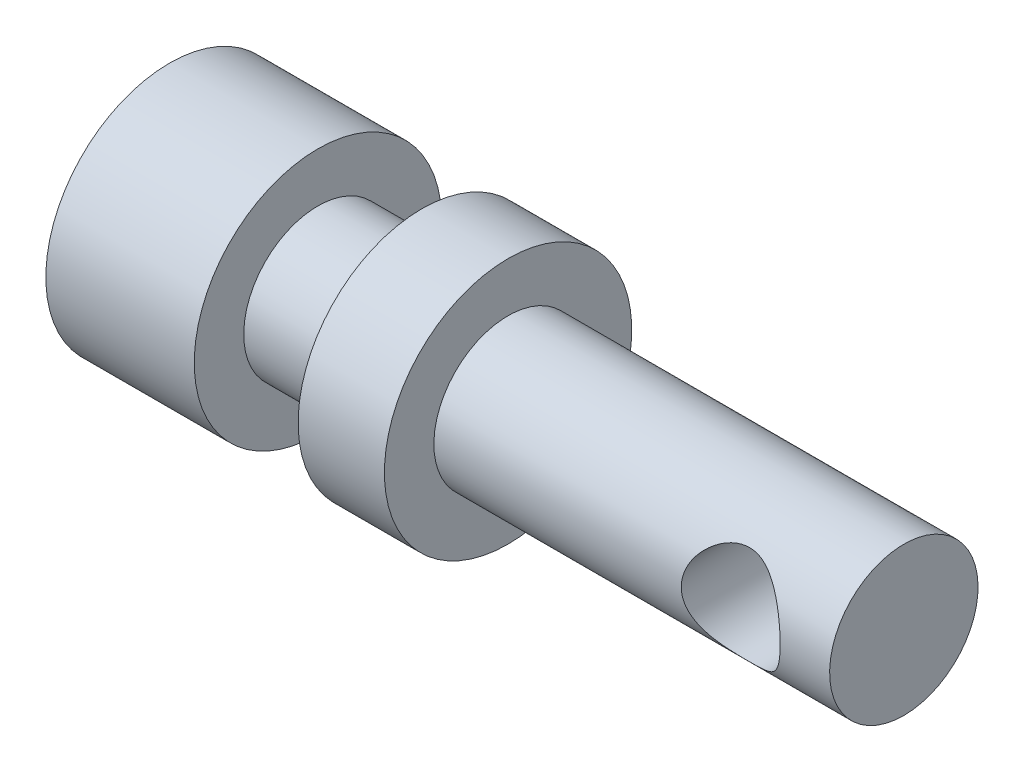
ISO-10303-21;
HEADER;
FILE_DESCRIPTION(('STEP AP214'),'2;1');
FILE_NAME('part.step','',(''),(''),'','','');
FILE_SCHEMA(('AUTOMOTIVE_DESIGN { 1 0 10303 214 1 1 1 1 }'));
ENDSEC;
DATA;
#1=APPLICATION_CONTEXT('core data for automotive mechanical design processes');
#2=APPLICATION_PROTOCOL_DEFINITION('international standard','automotive_design',2000,#1);
#3=PRODUCT_CONTEXT('',#1,'mechanical');
#4=PRODUCT('Part','Part','',(#3));
#5=PRODUCT_RELATED_PRODUCT_CATEGORY('part','',(#4));
#6=PRODUCT_DEFINITION_FORMATION('','',#4);
#7=PRODUCT_DEFINITION_CONTEXT('part definition',#1,'design');
#8=PRODUCT_DEFINITION('design','',#6,#7);
#9=PRODUCT_DEFINITION_SHAPE('','',#8);
#10=(LENGTH_UNIT() NAMED_UNIT(*) SI_UNIT(.MILLI.,.METRE.));
#11=(NAMED_UNIT(*) PLANE_ANGLE_UNIT() SI_UNIT($,.RADIAN.));
#12=(NAMED_UNIT(*) SI_UNIT($,.STERADIAN.) SOLID_ANGLE_UNIT());
#13=UNCERTAINTY_MEASURE_WITH_UNIT(LENGTH_MEASURE(1.E-05),#10,'distance_accuracy_value','');
#14=(GEOMETRIC_REPRESENTATION_CONTEXT(3) GLOBAL_UNCERTAINTY_ASSIGNED_CONTEXT((#13)) GLOBAL_UNIT_ASSIGNED_CONTEXT((#10,
#11,#12)) REPRESENTATION_CONTEXT('',''));
#15=CARTESIAN_POINT('',(0.,0.,0.));
#16=DIRECTION('',(0.,0.,1.));
#17=DIRECTION('',(1.,0.,0.));
#18=AXIS2_PLACEMENT_3D('',#15,#16,#17);
#19=CARTESIAN_POINT('',(0.,0.,0.));
#20=DIRECTION('',(-1.,0.,0.));
#21=DIRECTION('',(0.,-1.,0.));
#22=AXIS2_PLACEMENT_3D('',#19,#20,#21);
#23=CYLINDRICAL_SURFACE('',#22,2.5);
#24=CARTESIAN_POINT('',(0.,0.,0.));
#25=DIRECTION('',(-1.,0.,0.));
#26=DIRECTION('',(0.,-1.,0.));
#27=AXIS2_PLACEMENT_3D('',#24,#25,#26);
#28=CIRCLE('',#27,2.5);
#29=CARTESIAN_POINT('',(0.,-2.5,0.));
#30=VERTEX_POINT('',#29);
#31=EDGE_CURVE('E10',#30,#30,#28,.T.);
#32=ORIENTED_EDGE('',*,*,#31,.F.);
#33=EDGE_LOOP('',(#32));
#34=FACE_BOUND('',#33,.T.);
#35=CARTESIAN_POINT('',(3.,0.,0.));
#36=DIRECTION('',(-1.,0.,0.));
#37=DIRECTION('',(0.,-1.,0.));
#38=AXIS2_PLACEMENT_3D('',#35,#36,#37);
#39=CIRCLE('',#38,2.5);
#40=CARTESIAN_POINT('',(3.,-2.5,0.));
#41=VERTEX_POINT('',#40);
#42=EDGE_CURVE('E116',#41,#41,#39,.T.);
#43=ORIENTED_EDGE('',*,*,#42,.T.);
#44=EDGE_LOOP('',(#43));
#45=FACE_BOUND('',#44,.T.);
#46=ADVANCED_FACE('F43',(#34,#45),#23,.T.);
#47=CARTESIAN_POINT('',(0.,2.5,0.));
#48=DIRECTION('',(1.,0.,0.));
#49=DIRECTION('',(0.,1.,0.));
#50=AXIS2_PLACEMENT_3D('',#47,#48,#49);
#51=PLANE('',#50);
#52=ORIENTED_EDGE('',*,*,#31,.T.);
#53=EDGE_LOOP('',(#52));
#54=FACE_BOUND('',#53,.T.);
#55=ADVANCED_FACE('F108',(#54),#51,.F.);
#56=CARTESIAN_POINT('',(14.8439127302251,1.5,0.));
#57=DIRECTION('',(-1.,0.,0.));
#58=DIRECTION('',(0.,-1.,0.));
#59=AXIS2_PLACEMENT_3D('',#56,#57,#58);
#60=PLANE('',#59);
#61=CARTESIAN_POINT('',(14.8439127302251,0.,0.));
#62=DIRECTION('',(-1.,0.,0.));
#63=DIRECTION('',(0.,-1.,0.));
#64=AXIS2_PLACEMENT_3D('',#61,#62,#63);
#65=CIRCLE('',#64,1.5);
#66=CARTESIAN_POINT('',(14.8439127302251,-1.5,0.));
#67=VERTEX_POINT('',#66);
#68=EDGE_CURVE('E56',#67,#67,#65,.T.);
#69=ORIENTED_EDGE('',*,*,#68,.F.);
#70=EDGE_LOOP('',(#69));
#71=FACE_BOUND('',#70,.T.);
#72=ADVANCED_FACE('F103',(#71),#60,.F.);
#73=CARTESIAN_POINT('',(0.,0.,0.));
#74=DIRECTION('',(-1.,0.,0.));
#75=DIRECTION('',(0.,-1.,0.));
#76=AXIS2_PLACEMENT_3D('',#73,#74,#75);
#77=CYLINDRICAL_SURFACE('',#76,1.5);
#78=CARTESIAN_POINT('',(13.8439127302251,0.,-1.5));
#79=CARTESIAN_POINT('',(13.8439130050413,0.050242358334064,-1.50000020822414));
#80=CARTESIAN_POINT('',(13.8401057452474,0.100484543566457,-1.49745401376693));
#81=CARTESIAN_POINT('',(13.8251142981723,0.199366529015833,-1.48752326211906));
#82=CARTESIAN_POINT('',(13.8139266086635,0.248005556977501,-1.48013640790618));
#83=CARTESIAN_POINT('',(13.7848588715627,0.342106153927126,-1.46125241202354));
#84=CARTESIAN_POINT('',(13.7670101602211,0.387581436328777,-1.44977452746657));
#85=CARTESIAN_POINT('',(13.7253810485894,0.474707645498629,-1.4236306893872));
#86=CARTESIAN_POINT('',(13.7015997870748,0.516358015804834,-1.40896427302755));
#87=CARTESIAN_POINT('',(13.6465842615414,0.598642350385054,-1.37613664684919));
#88=CARTESIAN_POINT('',(13.6148887998537,0.638890152730337,-1.3577844878966));
#89=CARTESIAN_POINT('',(13.5460477058959,0.713864022346369,-1.31991156541733));
#90=CARTESIAN_POINT('',(13.5088942653062,0.748582027719439,-1.30038915178416));
#91=CARTESIAN_POINT('',(13.4233865464188,0.81711148872748,-1.25864132339397));
#92=CARTESIAN_POINT('',(13.3741899036234,0.849915931813755,-1.236475339689));
#93=CARTESIAN_POINT('',(13.2697310414018,0.906751785070868,-1.19542073676408));
#94=CARTESIAN_POINT('',(13.2144795294437,0.930798367132494,-1.17652647977327));
#95=CARTESIAN_POINT('',(13.1155570835143,0.963370175057203,-1.14988133320735));
#96=CARTESIAN_POINT('',(13.0731485037882,0.974372236180081,-1.14048813946218));
#97=CARTESIAN_POINT('',(12.9865404778542,0.990753088926099,-1.12628984829786));
#98=CARTESIAN_POINT('',(12.9423442558619,0.99614157325966,-1.12147684372013));
#99=CARTESIAN_POINT('',(12.853175340797,1.00095682070629,-1.11718302804083));
#100=CARTESIAN_POINT('',(12.8082002184995,1.0003592145882,-1.11772401279478));
#101=CARTESIAN_POINT('',(12.7190952434746,0.993187906666195,-1.12409887741485));
#102=CARTESIAN_POINT('',(12.6749661392088,0.986609141899784,-1.12993724142592));
#103=CARTESIAN_POINT('',(12.5906792046063,0.968324971088711,-1.14563592995791));
#104=CARTESIAN_POINT('',(12.5504320622636,0.956858557405002,-1.15530744165153));
#105=CARTESIAN_POINT('',(12.4724008847293,0.929350592909501,-1.17754811463845));
#106=CARTESIAN_POINT('',(12.4346176650765,0.913307536614354,-1.19011822916388));
#107=CARTESIAN_POINT('',(12.354400032584,0.873369093698318,-1.21982098202212));
#108=CARTESIAN_POINT('',(12.312582780131,0.848540261643841,-1.23736158924507));
#109=CARTESIAN_POINT('',(12.2332210327332,0.793344802336527,-1.27345768922483));
#110=CARTESIAN_POINT('',(12.195681901388,0.762971345040337,-1.29201441370947));
#111=CARTESIAN_POINT('',(12.1176414573695,0.68990582655971,-1.33271671862096));
#112=CARTESIAN_POINT('',(12.0782457058694,0.645969691404498,-1.35477372355024));
#113=CARTESIAN_POINT('',(12.0073144829702,0.551003999553809,-1.39609050337857));
#114=CARTESIAN_POINT('',(11.9757716575241,0.499981149675163,-1.41535288825285));
#115=CARTESIAN_POINT('',(11.9271738709109,0.4024289135456,-1.44572702044166));
#116=CARTESIAN_POINT('',(11.9084910485549,0.356978821685241,-1.45769630582498));
#117=CARTESIAN_POINT('',(11.8778602674132,0.263018021968454,-1.47753859515521));
#118=CARTESIAN_POINT('',(11.8659066166592,0.214509939501018,-1.48541506063844));
#119=CARTESIAN_POINT('',(11.8493321476059,0.115492726585947,-1.49637941078331));
#120=CARTESIAN_POINT('',(11.8447429997559,0.0649759059670232,-1.49944661230576));
#121=CARTESIAN_POINT('',(11.843289185944,-0.0362207596946174,-1.50041557482591));
#122=CARTESIAN_POINT('',(11.8464239799807,-0.0869005930932825,-1.49831769692815));
#123=CARTESIAN_POINT('',(11.8597247580061,-0.183227858602148,-1.48949794712138));
#124=CARTESIAN_POINT('',(11.8693813791028,-0.228978722339656,-1.48311123195135));
#125=CARTESIAN_POINT('',(11.8947105732315,-0.318058196213641,-1.46659224642397));
#126=CARTESIAN_POINT('',(11.910384105689,-0.361386418785356,-1.45645937873408));
#127=CARTESIAN_POINT('',(11.9482388787478,-0.447332375233222,-1.4324817626467));
#128=CARTESIAN_POINT('',(11.9707568072669,-0.489748092316564,-1.41844935068245));
#129=CARTESIAN_POINT('',(12.0211293751974,-0.57034151197779,-1.38800927805403));
#130=CARTESIAN_POINT('',(12.0489873104881,-0.608516574097255,-1.37160015200652));
#131=CARTESIAN_POINT('',(12.1142166643075,-0.685927227415324,-1.33477273328243));
#132=CARTESIAN_POINT('',(12.1523958602771,-0.724375937862666,-1.31413078406203));
#133=CARTESIAN_POINT('',(12.2344684451892,-0.794669840332393,-1.27285586536855));
#134=CARTESIAN_POINT('',(12.2783657497245,-0.826510468230434,-1.25222291185946));
#135=CARTESIAN_POINT('',(12.3674839366543,-0.880623882794763,-1.21469839506517));
#136=CARTESIAN_POINT('',(12.412278747125,-0.903478180804394,-1.19763798588662));
#137=CARTESIAN_POINT('',(12.5058490566157,-0.942481068876251,-1.16719487207113));
#138=CARTESIAN_POINT('',(12.5546171994228,-0.958641728453858,-1.1538055628277));
#139=CARTESIAN_POINT('',(12.6461949737921,-0.981179217293118,-1.13466604076533));
#140=CARTESIAN_POINT('',(12.6884986351546,-0.988792987823091,-1.12797499006895));
#141=CARTESIAN_POINT('',(12.7741993708928,-0.998496029624887,-1.11939733222929));
#142=CARTESIAN_POINT('',(12.8175952057983,-1.00059130142516,-1.11750550674066));
#143=CARTESIAN_POINT('',(12.9042342585835,-0.999119609907756,-1.11882100574833));
#144=CARTESIAN_POINT('',(12.9474773709066,-0.995549293852656,-1.12203134956834));
#145=CARTESIAN_POINT('',(13.0325844944966,-0.98298498610997,-1.1330522619864));
#146=CARTESIAN_POINT('',(13.0744465871555,-0.973983758587649,-1.14086896751217));
#147=CARTESIAN_POINT('',(13.1667683234394,-0.947965178356308,-1.1626342196827));
#148=CARTESIAN_POINT('',(13.2165465865946,-0.929450935941993,-1.17766166854603));
#149=CARTESIAN_POINT('',(13.3116561473145,-0.885422631474873,-1.21111080629161));
#150=CARTESIAN_POINT('',(13.3569810791935,-0.859898741785419,-1.22953724861883));
#151=CARTESIAN_POINT('',(13.4435536738219,-0.801991402694656,-1.26808593269726));
#152=CARTESIAN_POINT('',(13.4847121029444,-0.76949154944827,-1.28823293691071));
#153=CARTESIAN_POINT('',(13.5615739693463,-0.698358840177307,-1.32814150773993));
#154=CARTESIAN_POINT('',(13.5972757287375,-0.659724105134949,-1.3479029541764));
#155=CARTESIAN_POINT('',(13.6672687823822,-0.570728664877765,-1.38815775980392));
#156=CARTESIAN_POINT('',(13.7006220503149,-0.519480834775983,-1.40834902724558));
#157=CARTESIAN_POINT('',(13.7578693685571,-0.410434277887485,-1.44388832937518));
#158=CARTESIAN_POINT('',(13.7817782836369,-0.352646031225018,-1.45924396722731));
#159=CARTESIAN_POINT('',(13.8144900193071,-0.245717534917522,-1.48050822418367));
#160=CARTESIAN_POINT('',(13.8254682497744,-0.197506162628864,-1.48775740184446));
#161=CARTESIAN_POINT('',(13.8401767464941,-0.099529006012064,-1.49750140070948));
#162=CARTESIAN_POINT('',(13.8439124580231,-0.049764418094028,-1.49999979375663));
#163=CARTESIAN_POINT('',(13.8439127302251,0.,-1.5));
#164=B_SPLINE_CURVE_WITH_KNOTS('',3,(#78,#79,#80,#81,#82,#83,#84,#85,#86,#87,#88,#89,#90,#91,
#92,#93,#94,#95,#96,#97,#98,#99,#100,#101,#102,#103,#104,#105,#106,#107,#108,#109,#110,#111,
#112,#113,#114,#115,#116,#117,#118,#119,#120,#121,#122,#123,#124,#125,#126,#127,#128,#129,#130,
#131,#132,#133,#134,#135,#136,#137,#138,#139,#140,#141,#142,#143,#144,#145,#146,#147,#148,#149,
#150,#151,#152,#153,#154,#155,#156,#157,#158,#159,#160,#161,#162,#163),.UNSPECIFIED.,.T.,.F.,(4,
2,2,2,2,2,2,2,2,2,2,2,2,2,2,2,2,2,2,2,2,2,2,2,2,2,2,2,2,2,2,2,2,2,2,2,2,2,2,2,2,2,4),(0.,
0.1505266132527,0.301124707174344,0.451023076595116,0.600943219336933,0.763585145002782,
0.926462058021592,1.11503341647991,1.30327652722719,1.43716846838014,1.57082883922904,
1.70503355867689,1.83935198631676,1.96774431099011,2.09617891902539,2.25073787329797,
2.40548851889212,2.5935947724756,2.78152420149865,2.93262043847563,3.0835886757059,
3.23520441646309,3.38680955765891,3.5277654239542,3.66874377568319,3.81826173413942,
3.96787227471786,4.1411408806983,4.31452876587063,4.473249676497,4.63168313315306,
4.76162024003011,4.8914160016149,5.02128860137217,5.15133461921144,5.31603304346011,
5.48096356682587,5.64889622595852,5.81688041978686,6.00897675773025,6.20076953274023,
6.34997645676982,6.49907115623393),.UNSPECIFIED.);
#165=CARTESIAN_POINT('',(13.8439127302251,0.,-1.5));
#166=VERTEX_POINT('',#165);
#167=EDGE_CURVE('E46',#166,#166,#164,.T.);
#168=ORIENTED_EDGE('',*,*,#167,.T.);
#169=EDGE_LOOP('',(#168));
#170=FACE_BOUND('',#169,.T.);
#171=CARTESIAN_POINT('',(13.8439127302251,0.,1.5));
#172=CARTESIAN_POINT('',(13.8439130050413,-0.050242358334064,1.50000020822414));
#173=CARTESIAN_POINT('',(13.8401057452474,-0.100484543566457,1.49745401376693));
#174=CARTESIAN_POINT('',(13.8251142981723,-0.199366529015833,1.48752326211906));
#175=CARTESIAN_POINT('',(13.8139266086635,-0.248005556977501,1.48013640790618));
#176=CARTESIAN_POINT('',(13.7848588715627,-0.342106153927126,1.46125241202354));
#177=CARTESIAN_POINT('',(13.7670101602211,-0.387581436328777,1.44977452746657));
#178=CARTESIAN_POINT('',(13.7253810485894,-0.474707645498629,1.4236306893872));
#179=CARTESIAN_POINT('',(13.7015997870748,-0.516358015804834,1.40896427302755));
#180=CARTESIAN_POINT('',(13.6465842615414,-0.598642350385054,1.37613664684919));
#181=CARTESIAN_POINT('',(13.6148887998537,-0.638890152730337,1.3577844878966));
#182=CARTESIAN_POINT('',(13.5460477058959,-0.713864022346369,1.31991156541733));
#183=CARTESIAN_POINT('',(13.5088942653062,-0.748582027719439,1.30038915178416));
#184=CARTESIAN_POINT('',(13.4233865464188,-0.81711148872748,1.25864132339398));
#185=CARTESIAN_POINT('',(13.3741899036234,-0.849915931813755,1.236475339689));
#186=CARTESIAN_POINT('',(13.2697310414018,-0.906751785070867,1.19542073676408));
#187=CARTESIAN_POINT('',(13.2144795294437,-0.930798367132494,1.17652647977327));
#188=CARTESIAN_POINT('',(13.1155570835143,-0.963370175057203,1.14988133320736));
#189=CARTESIAN_POINT('',(13.0731485037882,-0.974372236180082,1.14048813946218));
#190=CARTESIAN_POINT('',(12.9865404778542,-0.9907530889261,1.12628984829786));
#191=CARTESIAN_POINT('',(12.9423442558619,-0.99614157325966,1.12147684372013));
#192=CARTESIAN_POINT('',(12.853175340797,-1.00095682070629,1.11718302804084));
#193=CARTESIAN_POINT('',(12.8082002184995,-1.0003592145882,1.11772401279479));
#194=CARTESIAN_POINT('',(12.7190952434746,-0.993187906666194,1.12409887741486));
#195=CARTESIAN_POINT('',(12.6749661392088,-0.986609141899783,1.12993724142592));
#196=CARTESIAN_POINT('',(12.5906792046063,-0.968324971088711,1.14563592995791));
#197=CARTESIAN_POINT('',(12.5504320622636,-0.956858557405002,1.15530744165153));
#198=CARTESIAN_POINT('',(12.4724008847293,-0.9293505929095,1.17754811463845));
#199=CARTESIAN_POINT('',(12.4346176650765,-0.913307536614353,1.19011822916389));
#200=CARTESIAN_POINT('',(12.354400032584,-0.873369093698316,1.21982098202212));
#201=CARTESIAN_POINT('',(12.312582780131,-0.848540261643839,1.23736158924507));
#202=CARTESIAN_POINT('',(12.2332210327332,-0.793344802336525,1.27345768922484));
#203=CARTESIAN_POINT('',(12.195681901388,-0.762971345040334,1.29201441370947));
#204=CARTESIAN_POINT('',(12.1176414573695,-0.689905826559707,1.33271671862096));
#205=CARTESIAN_POINT('',(12.0782457058694,-0.645969691404495,1.35477372355025));
#206=CARTESIAN_POINT('',(12.0073144829702,-0.551003999553805,1.39609050337857));
#207=CARTESIAN_POINT('',(11.9757716575241,-0.499981149675159,1.41535288825285));
#208=CARTESIAN_POINT('',(11.9271738709109,-0.402428913545597,1.44572702044166));
#209=CARTESIAN_POINT('',(11.9084910485549,-0.356978821685238,1.45769630582498));
#210=CARTESIAN_POINT('',(11.8778602674132,-0.263018021968451,1.47753859515521));
#211=CARTESIAN_POINT('',(11.8659066166592,-0.214509939501014,1.48541506063844));
#212=CARTESIAN_POINT('',(11.8493321476059,-0.115492726585944,1.49637941078331));
#213=CARTESIAN_POINT('',(11.8447429997559,-0.06497590596702,1.49944661230576));
#214=CARTESIAN_POINT('',(11.843289185944,0.0362207596946203,1.50041557482591));
#215=CARTESIAN_POINT('',(11.8464239799807,0.0869005930932854,1.49831769692815));
#216=CARTESIAN_POINT('',(11.8597247580061,0.18322785860215,1.48949794712138));
#217=CARTESIAN_POINT('',(11.8693813791028,0.228978722339659,1.48311123195135));
#218=CARTESIAN_POINT('',(11.8947105732315,0.318058196213643,1.46659224642396));
#219=CARTESIAN_POINT('',(11.910384105689,0.361386418785358,1.45645937873408));
#220=CARTESIAN_POINT('',(11.9482388787478,0.447332375233224,1.4324817626467));
#221=CARTESIAN_POINT('',(11.9707568072669,0.489748092316567,1.41844935068245));
#222=CARTESIAN_POINT('',(12.0211293751974,0.570341511977793,1.38800927805403));
#223=CARTESIAN_POINT('',(12.0489873104881,0.608516574097258,1.37160015200651));
#224=CARTESIAN_POINT('',(12.1142166643075,0.685927227415326,1.33477273328242));
#225=CARTESIAN_POINT('',(12.1523958602771,0.724375937862667,1.31413078406203));
#226=CARTESIAN_POINT('',(12.2344684451892,0.794669840332395,1.27285586536854));
#227=CARTESIAN_POINT('',(12.2783657497245,0.826510468230436,1.25222291185946));
#228=CARTESIAN_POINT('',(12.3674839366543,0.880623882794765,1.21469839506517));
#229=CARTESIAN_POINT('',(12.412278747125,0.903478180804395,1.19763798588661));
#230=CARTESIAN_POINT('',(12.5058490566157,0.942481068876252,1.16719487207113));
#231=CARTESIAN_POINT('',(12.5546171994228,0.958641728453859,1.1538055628277));
#232=CARTESIAN_POINT('',(12.6461949737922,0.981179217293119,1.13466604076532));
#233=CARTESIAN_POINT('',(12.6884986351546,0.988792987823092,1.12797499006895));
#234=CARTESIAN_POINT('',(12.7741993708928,0.998496029624888,1.11939733222928));
#235=CARTESIAN_POINT('',(12.8175952057983,1.00059130142516,1.11750550674066));
#236=CARTESIAN_POINT('',(12.9042342585835,0.999119609907756,1.11882100574833));
#237=CARTESIAN_POINT('',(12.9474773709066,0.995549293852655,1.12203134956834));
#238=CARTESIAN_POINT('',(13.0325844944966,0.982984986109969,1.1330522619864));
#239=CARTESIAN_POINT('',(13.0744465871555,0.973983758587648,1.14086896751217));
#240=CARTESIAN_POINT('',(13.1667683234394,0.947965178356306,1.1626342196827));
#241=CARTESIAN_POINT('',(13.2165465865946,0.92945093594199,1.17766166854603));
#242=CARTESIAN_POINT('',(13.3116561473145,0.88542263147487,1.21111080629161));
#243=CARTESIAN_POINT('',(13.3569810791935,0.859898741785416,1.22953724861883));
#244=CARTESIAN_POINT('',(13.4435536738219,0.801991402694652,1.26808593269726));
#245=CARTESIAN_POINT('',(13.4847121029444,0.769491549448266,1.28823293691071));
#246=CARTESIAN_POINT('',(13.5615739693463,0.698358840177302,1.32814150773994));
#247=CARTESIAN_POINT('',(13.5972757287375,0.659724105134943,1.34790295417641));
#248=CARTESIAN_POINT('',(13.6672687823822,0.570728664877759,1.38815775980393));
#249=CARTESIAN_POINT('',(13.7006220503149,0.519480834775977,1.40834902724558));
#250=CARTESIAN_POINT('',(13.7578693685571,0.410434277887479,1.44388832937518));
#251=CARTESIAN_POINT('',(13.7817782836369,0.352646031225011,1.45924396722731));
#252=CARTESIAN_POINT('',(13.8144900193071,0.245717534917515,1.48050822418367));
#253=CARTESIAN_POINT('',(13.8254682497744,0.197506162628859,1.48775740184446));
#254=CARTESIAN_POINT('',(13.8401767464941,0.0995290060120615,1.49750140070948));
#255=CARTESIAN_POINT('',(13.8439124580231,0.0497644180940267,1.49999979375663));
#256=CARTESIAN_POINT('',(13.8439127302251,0.,1.5));
#257=B_SPLINE_CURVE_WITH_KNOTS('',3,(#171,#172,#173,#174,#175,#176,#177,#178,#179,#180,#181,
#182,#183,#184,#185,#186,#187,#188,#189,#190,#191,#192,#193,#194,#195,#196,#197,#198,#199,#200,
#201,#202,#203,#204,#205,#206,#207,#208,#209,#210,#211,#212,#213,#214,#215,#216,#217,#218,#219,
#220,#221,#222,#223,#224,#225,#226,#227,#228,#229,#230,#231,#232,#233,#234,#235,#236,#237,#238,
#239,#240,#241,#242,#243,#244,#245,#246,#247,#248,#249,#250,#251,#252,#253,#254,#255,#256),
.UNSPECIFIED.,.T.,.F.,(4,2,2,2,2,2,2,2,2,2,2,2,2,2,2,2,2,2,2,2,2,2,2,2,2,2,2,2,2,2,2,2,2,2,2,2,
2,2,2,2,2,2,4),(0.,0.1505266132527,0.301124707174344,0.451023076595115,0.600943219336932,
0.763585145002782,0.926462058021592,1.11503341647991,1.30327652722719,1.43716846838014,
1.57082883922905,1.70503355867689,1.83935198631676,1.96774431099011,2.0961789190254,
2.25073787329797,2.40548851889213,2.5935947724756,2.78152420149865,2.93262043847563,
3.08358867570591,3.23520441646309,3.38680955765891,3.5277654239542,3.66874377568319,
3.81826173413942,3.96787227471786,4.1411408806983,4.31452876587063,4.47324967649701,
4.63168313315306,4.76162024003012,4.8914160016149,5.02128860137218,5.15133461921144,
5.31603304346011,5.48096356682587,5.64889622595853,5.81688041978687,6.00897675773025,
6.20076953274024,6.34997645676983,6.49907115623393),.UNSPECIFIED.);
#258=CARTESIAN_POINT('',(13.8439127302251,0.,1.5));
#259=VERTEX_POINT('',#258);
#260=EDGE_CURVE('E65',#259,#259,#257,.T.);
#261=ORIENTED_EDGE('',*,*,#260,.T.);
#262=EDGE_LOOP('',(#261));
#263=FACE_BOUND('',#262,.T.);
#264=CARTESIAN_POINT('',(6.8439127302251,0.,0.));
#265=DIRECTION('',(-1.,0.,0.));
#266=DIRECTION('',(0.,-1.,0.));
#267=AXIS2_PLACEMENT_3D('',#264,#265,#266);
#268=CIRCLE('',#267,1.5);
#269=CARTESIAN_POINT('',(6.8439127302251,-1.5,0.));
#270=VERTEX_POINT('',#269);
#271=EDGE_CURVE('E62',#270,#270,#268,.T.);
#272=ORIENTED_EDGE('',*,*,#271,.F.);
#273=EDGE_LOOP('',(#272));
#274=FACE_BOUND('',#273,.T.);
#275=ORIENTED_EDGE('',*,*,#68,.T.);
#276=EDGE_LOOP('',(#275));
#277=FACE_BOUND('',#276,.T.);
#278=ADVANCED_FACE('F71',(#170,#263,#274,#277),#77,.T.);
#279=CARTESIAN_POINT('',(6.8439127302251,2.5,0.));
#280=DIRECTION('',(-1.,0.,0.));
#281=DIRECTION('',(0.,-1.,0.));
#282=AXIS2_PLACEMENT_3D('',#279,#280,#281);
#283=PLANE('',#282);
#284=CARTESIAN_POINT('',(6.8439127302251,0.,0.));
#285=DIRECTION('',(-1.,0.,0.));
#286=DIRECTION('',(0.,-1.,0.));
#287=AXIS2_PLACEMENT_3D('',#284,#285,#286);
#288=CIRCLE('',#287,2.5);
#289=CARTESIAN_POINT('',(6.8439127302251,-2.5,0.));
#290=VERTEX_POINT('',#289);
#291=EDGE_CURVE('E134',#290,#290,#288,.T.);
#292=ORIENTED_EDGE('',*,*,#291,.F.);
#293=EDGE_LOOP('',(#292));
#294=FACE_BOUND('',#293,.T.);
#295=ORIENTED_EDGE('',*,*,#271,.T.);
#296=EDGE_LOOP('',(#295));
#297=FACE_BOUND('',#296,.T.);
#298=ADVANCED_FACE('F95',(#294,#297),#283,.F.);
#299=CARTESIAN_POINT('',(0.,0.,0.));
#300=DIRECTION('',(-1.,0.,0.));
#301=DIRECTION('',(0.,-1.,0.));
#302=AXIS2_PLACEMENT_3D('',#299,#300,#301);
#303=CYLINDRICAL_SURFACE('',#302,2.5);
#304=CARTESIAN_POINT('',(5.1,0.,0.));
#305=DIRECTION('',(-1.,0.,0.));
#306=DIRECTION('',(0.,-1.,0.));
#307=AXIS2_PLACEMENT_3D('',#304,#305,#306);
#308=CIRCLE('',#307,2.5);
#309=CARTESIAN_POINT('',(5.1,-2.5,0.));
#310=VERTEX_POINT('',#309);
#311=EDGE_CURVE('E130',#310,#310,#308,.T.);
#312=ORIENTED_EDGE('',*,*,#311,.F.);
#313=EDGE_LOOP('',(#312));
#314=FACE_BOUND('',#313,.T.);
#315=ORIENTED_EDGE('',*,*,#291,.T.);
#316=EDGE_LOOP('',(#315));
#317=FACE_BOUND('',#316,.T.);
#318=ADVANCED_FACE('F92',(#314,#317),#303,.T.);
#319=CARTESIAN_POINT('',(5.1,2.5,0.));
#320=DIRECTION('',(1.,0.,0.));
#321=DIRECTION('',(0.,1.,0.));
#322=AXIS2_PLACEMENT_3D('',#319,#320,#321);
#323=PLANE('',#322);
#324=CARTESIAN_POINT('',(5.1,0.,0.));
#325=DIRECTION('',(-1.,0.,0.));
#326=DIRECTION('',(0.,-1.,0.));
#327=AXIS2_PLACEMENT_3D('',#324,#325,#326);
#328=CIRCLE('',#327,1.5);
#329=CARTESIAN_POINT('',(5.1,-1.5,0.));
#330=VERTEX_POINT('',#329);
#331=EDGE_CURVE('E123',#330,#330,#328,.T.);
#332=ORIENTED_EDGE('',*,*,#331,.F.);
#333=EDGE_LOOP('',(#332));
#334=FACE_BOUND('',#333,.T.);
#335=ORIENTED_EDGE('',*,*,#311,.T.);
#336=EDGE_LOOP('',(#335));
#337=FACE_BOUND('',#336,.T.);
#338=ADVANCED_FACE('F88',(#334,#337),#323,.F.);
#339=CARTESIAN_POINT('',(0.,0.,0.));
#340=DIRECTION('',(-1.,0.,0.));
#341=DIRECTION('',(0.,-1.,0.));
#342=AXIS2_PLACEMENT_3D('',#339,#340,#341);
#343=CYLINDRICAL_SURFACE('',#342,1.5);
#344=CARTESIAN_POINT('',(3.,0.,0.));
#345=DIRECTION('',(-1.,0.,0.));
#346=DIRECTION('',(0.,-1.,0.));
#347=AXIS2_PLACEMENT_3D('',#344,#345,#346);
#348=CIRCLE('',#347,1.5);
#349=CARTESIAN_POINT('',(3.,-1.5,0.));
#350=VERTEX_POINT('',#349);
#351=EDGE_CURVE('E118',#350,#350,#348,.T.);
#352=ORIENTED_EDGE('',*,*,#351,.F.);
#353=EDGE_LOOP('',(#352));
#354=FACE_BOUND('',#353,.T.);
#355=ORIENTED_EDGE('',*,*,#331,.T.);
#356=EDGE_LOOP('',(#355));
#357=FACE_BOUND('',#356,.T.);
#358=ADVANCED_FACE('F84',(#354,#357),#343,.T.);
#359=CARTESIAN_POINT('',(3.,1.5,0.));
#360=DIRECTION('',(-1.,0.,0.));
#361=DIRECTION('',(0.,-1.,0.));
#362=AXIS2_PLACEMENT_3D('',#359,#360,#361);
#363=PLANE('',#362);
#364=ORIENTED_EDGE('',*,*,#42,.F.);
#365=EDGE_LOOP('',(#364));
#366=FACE_BOUND('',#365,.T.);
#367=ORIENTED_EDGE('',*,*,#351,.T.);
#368=EDGE_LOOP('',(#367));
#369=FACE_BOUND('',#368,.T.);
#370=ADVANCED_FACE('F79',(#366,#369),#363,.F.);
#371=CARTESIAN_POINT('',(12.8439127302251,0.,-2.5));
#372=DIRECTION('',(0.,0.,1.));
#373=DIRECTION('',(1.,0.,0.));
#374=AXIS2_PLACEMENT_3D('',#371,#372,#373);
#375=CYLINDRICAL_SURFACE('',#374,1.);
#376=ORIENTED_EDGE('',*,*,#260,.F.);
#377=EDGE_LOOP('',(#376));
#378=FACE_BOUND('',#377,.T.);
#379=ORIENTED_EDGE('',*,*,#167,.F.);
#380=EDGE_LOOP('',(#379));
#381=FACE_BOUND('',#380,.T.);
#382=ADVANCED_FACE('F75',(#378,#381),#375,.F.);
#383=CLOSED_SHELL('',(#46,#55,#72,#278,#298,#318,#338,#358,#370,#382));
#384=MANIFOLD_SOLID_BREP('B2',#383);
#385=ADVANCED_BREP_SHAPE_REPRESENTATION('',(#18,#384),#14);
#386=SHAPE_DEFINITION_REPRESENTATION(#9,#385);
ENDSEC;
END-ISO-10303-21;
